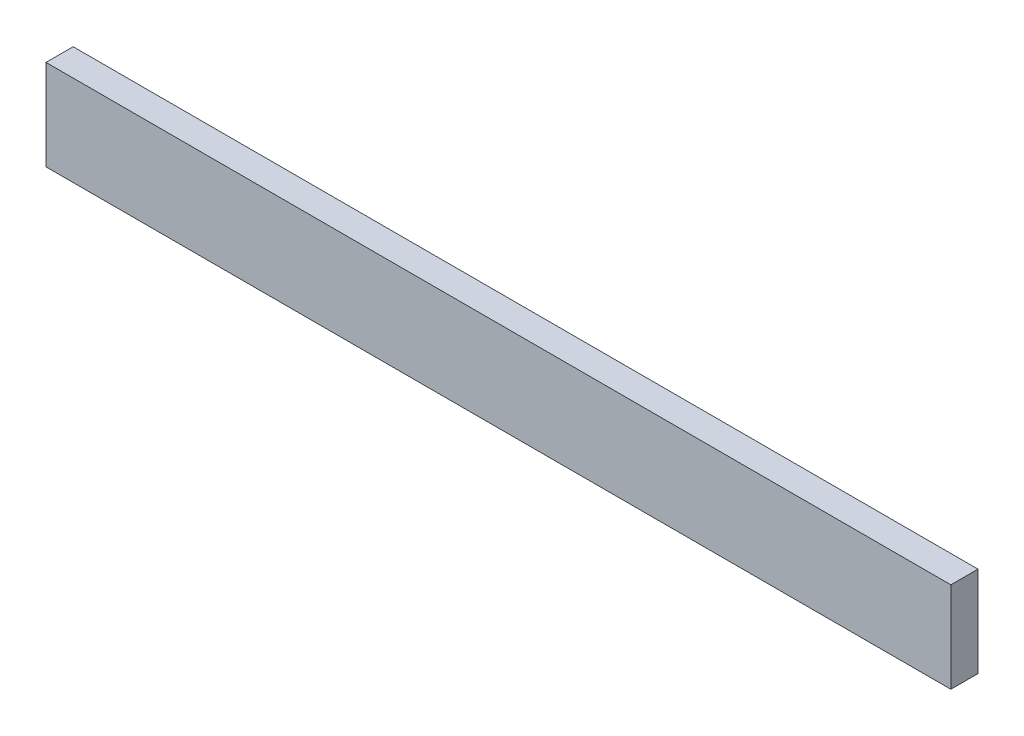
ISO-10303-21;
HEADER;
FILE_DESCRIPTION(('STEP AP214'),'2;1');
FILE_NAME('part.step','',(''),(''),'','','');
FILE_SCHEMA(('AUTOMOTIVE_DESIGN { 1 0 10303 214 1 1 1 1 }'));
ENDSEC;
DATA;
#1=APPLICATION_CONTEXT('core data for automotive mechanical design processes');
#2=APPLICATION_PROTOCOL_DEFINITION('international standard','automotive_design',2000,#1);
#3=PRODUCT_CONTEXT('',#1,'mechanical');
#4=PRODUCT('Part','Part','',(#3));
#5=PRODUCT_RELATED_PRODUCT_CATEGORY('part','',(#4));
#6=PRODUCT_DEFINITION_FORMATION('','',#4);
#7=PRODUCT_DEFINITION_CONTEXT('part definition',#1,'design');
#8=PRODUCT_DEFINITION('design','',#6,#7);
#9=PRODUCT_DEFINITION_SHAPE('','',#8);
#10=(LENGTH_UNIT() NAMED_UNIT(*) SI_UNIT(.MILLI.,.METRE.));
#11=(NAMED_UNIT(*) PLANE_ANGLE_UNIT() SI_UNIT($,.RADIAN.));
#12=(NAMED_UNIT(*) SI_UNIT($,.STERADIAN.) SOLID_ANGLE_UNIT());
#13=UNCERTAINTY_MEASURE_WITH_UNIT(LENGTH_MEASURE(1.E-05),#10,'distance_accuracy_value','');
#14=(GEOMETRIC_REPRESENTATION_CONTEXT(3) GLOBAL_UNCERTAINTY_ASSIGNED_CONTEXT((#13)) GLOBAL_UNIT_ASSIGNED_CONTEXT((#10,
#11,#12)) REPRESENTATION_CONTEXT('',''));
#15=CARTESIAN_POINT('',(0.,0.,0.));
#16=DIRECTION('',(0.,0.,1.));
#17=DIRECTION('',(1.,0.,0.));
#18=AXIS2_PLACEMENT_3D('',#15,#16,#17);
#19=CARTESIAN_POINT('',(0.,0.,3.));
#20=DIRECTION('',(1.,0.,0.));
#21=DIRECTION('',(0.,1.,0.));
#22=AXIS2_PLACEMENT_3D('',#19,#20,#21);
#23=PLANE('',#22);
#24=DIRECTION('',(0.,-1.,0.));
#25=VECTOR('',#24,1.);
#26=CARTESIAN_POINT('',(0.,0.,0.));
#27=LINE('',#26,#25);
#28=CARTESIAN_POINT('',(0.,10.,0.));
#29=VERTEX_POINT('',#28);
#30=CARTESIAN_POINT('',(0.,0.,0.));
#31=VERTEX_POINT('',#30);
#32=EDGE_CURVE('E107',#29,#31,#27,.T.);
#33=ORIENTED_EDGE('',*,*,#32,.T.);
#34=DIRECTION('',(0.,0.,-1.));
#35=VECTOR('',#34,1.);
#36=CARTESIAN_POINT('',(0.,0.,3.));
#37=LINE('',#36,#35);
#38=CARTESIAN_POINT('',(0.,0.,3.));
#39=VERTEX_POINT('',#38);
#40=EDGE_CURVE('E11',#39,#31,#37,.T.);
#41=ORIENTED_EDGE('',*,*,#40,.F.);
#42=DIRECTION('',(0.,-1.,0.));
#43=VECTOR('',#42,1.);
#44=CARTESIAN_POINT('',(0.,0.,3.));
#45=LINE('',#44,#43);
#46=CARTESIAN_POINT('',(0.,10.,3.));
#47=VERTEX_POINT('',#46);
#48=EDGE_CURVE('E91',#47,#39,#45,.T.);
#49=ORIENTED_EDGE('',*,*,#48,.F.);
#50=DIRECTION('',(0.,0.,-1.));
#51=VECTOR('',#50,1.);
#52=CARTESIAN_POINT('',(0.,10.,3.));
#53=LINE('',#52,#51);
#54=EDGE_CURVE('E103',#47,#29,#53,.T.);
#55=ORIENTED_EDGE('',*,*,#54,.T.);
#56=EDGE_LOOP('',(#33,#41,#49,#55));
#57=FACE_BOUND('',#56,.T.);
#58=ADVANCED_FACE('F39',(#57),#23,.F.);
#59=CARTESIAN_POINT('',(0.,0.,3.));
#60=DIRECTION('',(0.,1.,0.));
#61=DIRECTION('',(0.,0.,1.));
#62=AXIS2_PLACEMENT_3D('',#59,#60,#61);
#63=PLANE('',#62);
#64=DIRECTION('',(1.,0.,0.));
#65=VECTOR('',#64,1.);
#66=CARTESIAN_POINT('',(0.,0.,0.));
#67=LINE('',#66,#65);
#68=CARTESIAN_POINT('',(100.,0.,0.));
#69=VERTEX_POINT('',#68);
#70=EDGE_CURVE('E96',#31,#69,#67,.T.);
#71=ORIENTED_EDGE('',*,*,#70,.T.);
#72=DIRECTION('',(0.,0.,-1.));
#73=VECTOR('',#72,1.);
#74=CARTESIAN_POINT('',(100.,0.,3.));
#75=LINE('',#74,#73);
#76=CARTESIAN_POINT('',(100.,0.,3.));
#77=VERTEX_POINT('',#76);
#78=EDGE_CURVE('E48',#77,#69,#75,.T.);
#79=ORIENTED_EDGE('',*,*,#78,.F.);
#80=DIRECTION('',(1.,0.,0.));
#81=VECTOR('',#80,1.);
#82=CARTESIAN_POINT('',(0.,0.,3.));
#83=LINE('',#82,#81);
#84=EDGE_CURVE('E86',#39,#77,#83,.T.);
#85=ORIENTED_EDGE('',*,*,#84,.F.);
#86=ORIENTED_EDGE('',*,*,#40,.T.);
#87=EDGE_LOOP('',(#71,#79,#85,#86));
#88=FACE_BOUND('',#87,.T.);
#89=ADVANCED_FACE('F95',(#88),#63,.F.);
#90=CARTESIAN_POINT('',(100.,0.,3.));
#91=DIRECTION('',(-1.,0.,0.));
#92=DIRECTION('',(0.,-1.,0.));
#93=AXIS2_PLACEMENT_3D('',#90,#91,#92);
#94=PLANE('',#93);
#95=DIRECTION('',(0.,1.,0.));
#96=VECTOR('',#95,1.);
#97=CARTESIAN_POINT('',(100.,0.,0.));
#98=LINE('',#97,#96);
#99=CARTESIAN_POINT('',(100.,10.,0.));
#100=VERTEX_POINT('',#99);
#101=EDGE_CURVE('E73',#69,#100,#98,.T.);
#102=ORIENTED_EDGE('',*,*,#101,.T.);
#103=DIRECTION('',(0.,0.,-1.));
#104=VECTOR('',#103,1.);
#105=CARTESIAN_POINT('',(100.,10.,3.));
#106=LINE('',#105,#104);
#107=CARTESIAN_POINT('',(100.,10.,3.));
#108=VERTEX_POINT('',#107);
#109=EDGE_CURVE('E98',#108,#100,#106,.T.);
#110=ORIENTED_EDGE('',*,*,#109,.F.);
#111=DIRECTION('',(0.,1.,0.));
#112=VECTOR('',#111,1.);
#113=CARTESIAN_POINT('',(100.,0.,3.));
#114=LINE('',#113,#112);
#115=EDGE_CURVE('E89',#77,#108,#114,.T.);
#116=ORIENTED_EDGE('',*,*,#115,.F.);
#117=ORIENTED_EDGE('',*,*,#78,.T.);
#118=EDGE_LOOP('',(#102,#110,#116,#117));
#119=FACE_BOUND('',#118,.T.);
#120=ADVANCED_FACE('F99',(#119),#94,.F.);
#121=CARTESIAN_POINT('',(0.,10.,3.));
#122=DIRECTION('',(0.,-1.,0.));
#123=DIRECTION('',(0.,0.,-1.));
#124=AXIS2_PLACEMENT_3D('',#121,#122,#123);
#125=PLANE('',#124);
#126=DIRECTION('',(-1.,0.,0.));
#127=VECTOR('',#126,1.);
#128=CARTESIAN_POINT('',(0.,10.,0.));
#129=LINE('',#128,#127);
#130=EDGE_CURVE('E79',#100,#29,#129,.T.);
#131=ORIENTED_EDGE('',*,*,#130,.T.);
#132=ORIENTED_EDGE('',*,*,#54,.F.);
#133=DIRECTION('',(-1.,0.,0.));
#134=VECTOR('',#133,1.);
#135=CARTESIAN_POINT('',(0.,10.,3.));
#136=LINE('',#135,#134);
#137=EDGE_CURVE('E56',#108,#47,#136,.T.);
#138=ORIENTED_EDGE('',*,*,#137,.F.);
#139=ORIENTED_EDGE('',*,*,#109,.T.);
#140=EDGE_LOOP('',(#131,#132,#138,#139));
#141=FACE_BOUND('',#140,.T.);
#142=ADVANCED_FACE('F120',(#141),#125,.F.);
#143=CARTESIAN_POINT('',(0.,0.,3.));
#144=DIRECTION('',(0.,0.,-1.));
#145=DIRECTION('',(-1.,0.,0.));
#146=AXIS2_PLACEMENT_3D('',#143,#144,#145);
#147=PLANE('',#146);
#148=ORIENTED_EDGE('',*,*,#48,.T.);
#149=ORIENTED_EDGE('',*,*,#84,.T.);
#150=ORIENTED_EDGE('',*,*,#115,.T.);
#151=ORIENTED_EDGE('',*,*,#137,.T.);
#152=EDGE_LOOP('',(#148,#149,#150,#151));
#153=FACE_BOUND('',#152,.T.);
#154=ADVANCED_FACE('F87',(#153),#147,.F.);
#155=CARTESIAN_POINT('',(0.,0.,0.));
#156=DIRECTION('',(0.,0.,-1.));
#157=DIRECTION('',(-1.,0.,0.));
#158=AXIS2_PLACEMENT_3D('',#155,#156,#157);
#159=PLANE('',#158);
#160=ORIENTED_EDGE('',*,*,#32,.F.);
#161=ORIENTED_EDGE('',*,*,#130,.F.);
#162=ORIENTED_EDGE('',*,*,#101,.F.);
#163=ORIENTED_EDGE('',*,*,#70,.F.);
#164=EDGE_LOOP('',(#160,#161,#162,#163));
#165=FACE_BOUND('',#164,.T.);
#166=ADVANCED_FACE('F123',(#165),#159,.T.);
#167=CLOSED_SHELL('',(#58,#89,#120,#142,#154,#166));
#168=MANIFOLD_SOLID_BREP('B2',#167);
#169=ADVANCED_BREP_SHAPE_REPRESENTATION('',(#18,#168),#14);
#170=SHAPE_DEFINITION_REPRESENTATION(#9,#169);
ENDSEC;
END-ISO-10303-21;
